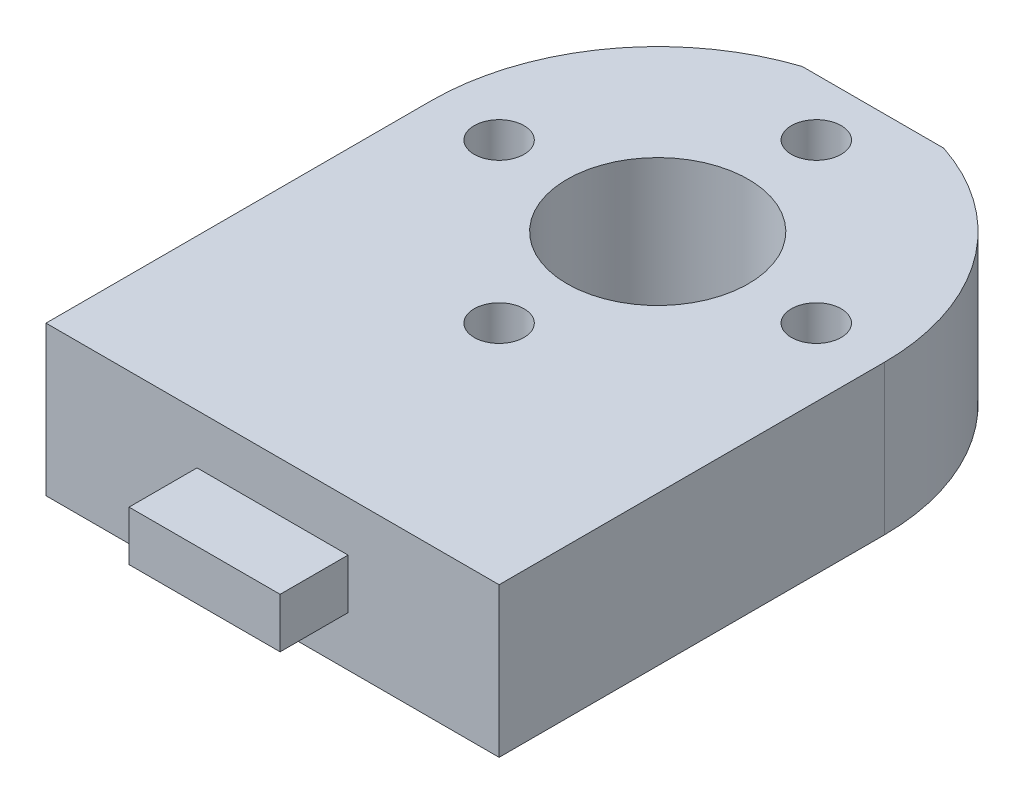
ISO-10303-21;
HEADER;
FILE_DESCRIPTION(('STEP AP214'),'2;1');
FILE_NAME('part.step','',(''),(''),'','','');
FILE_SCHEMA(('AUTOMOTIVE_DESIGN { 1 0 10303 214 1 1 1 1 }'));
ENDSEC;
DATA;
#1=APPLICATION_CONTEXT('core data for automotive mechanical design processes');
#2=APPLICATION_PROTOCOL_DEFINITION('international standard','automotive_design',2000,#1);
#3=PRODUCT_CONTEXT('',#1,'mechanical');
#4=PRODUCT('Part','Part','',(#3));
#5=PRODUCT_RELATED_PRODUCT_CATEGORY('part','',(#4));
#6=PRODUCT_DEFINITION_FORMATION('','',#4);
#7=PRODUCT_DEFINITION_CONTEXT('part definition',#1,'design');
#8=PRODUCT_DEFINITION('design','',#6,#7);
#9=PRODUCT_DEFINITION_SHAPE('','',#8);
#10=(LENGTH_UNIT() NAMED_UNIT(*) SI_UNIT(.MILLI.,.METRE.));
#11=(NAMED_UNIT(*) PLANE_ANGLE_UNIT() SI_UNIT($,.RADIAN.));
#12=(NAMED_UNIT(*) SI_UNIT($,.STERADIAN.) SOLID_ANGLE_UNIT());
#13=UNCERTAINTY_MEASURE_WITH_UNIT(LENGTH_MEASURE(1.E-05),#10,'distance_accuracy_value','');
#14=(GEOMETRIC_REPRESENTATION_CONTEXT(3) GLOBAL_UNCERTAINTY_ASSIGNED_CONTEXT((#13)) GLOBAL_UNIT_ASSIGNED_CONTEXT((#10,
#11,#12)) REPRESENTATION_CONTEXT('',''));
#15=CARTESIAN_POINT('',(0.,0.,0.));
#16=DIRECTION('',(0.,0.,1.));
#17=DIRECTION('',(1.,0.,0.));
#18=AXIS2_PLACEMENT_3D('',#15,#16,#17);
#19=CARTESIAN_POINT('',(-10.,6.6,17.));
#20=DIRECTION('',(0.,0.,-1.));
#21=DIRECTION('',(-1.,0.,0.));
#22=AXIS2_PLACEMENT_3D('',#19,#20,#21);
#23=PLANE('',#22);
#24=DIRECTION('',(1.,0.,0.));
#25=VECTOR('',#24,1.);
#26=CARTESIAN_POINT('',(-10.,0.,17.));
#27=LINE('',#26,#25);
#28=CARTESIAN_POINT('',(-10.,0.,17.));
#29=VERTEX_POINT('',#28);
#30=CARTESIAN_POINT('',(10.,0.,17.));
#31=VERTEX_POINT('',#30);
#32=EDGE_CURVE('E191',#29,#31,#27,.T.);
#33=ORIENTED_EDGE('',*,*,#32,.T.);
#34=DIRECTION('',(0.,-1.,0.));
#35=VECTOR('',#34,1.);
#36=CARTESIAN_POINT('',(10.,6.6,17.));
#37=LINE('',#36,#35);
#38=CARTESIAN_POINT('',(10.,6.6,17.));
#39=VERTEX_POINT('',#38);
#40=EDGE_CURVE('E48',#39,#31,#37,.T.);
#41=ORIENTED_EDGE('',*,*,#40,.F.);
#42=DIRECTION('',(1.,0.,0.));
#43=VECTOR('',#42,1.);
#44=CARTESIAN_POINT('',(-10.,6.6,17.));
#45=LINE('',#44,#43);
#46=CARTESIAN_POINT('',(-10.,6.6,17.));
#47=VERTEX_POINT('',#46);
#48=EDGE_CURVE('E177',#47,#39,#45,.T.);
#49=ORIENTED_EDGE('',*,*,#48,.F.);
#50=DIRECTION('',(0.,-1.,0.));
#51=VECTOR('',#50,1.);
#52=CARTESIAN_POINT('',(-10.,6.6,17.));
#53=LINE('',#52,#51);
#54=EDGE_CURVE('E11',#47,#29,#53,.T.);
#55=ORIENTED_EDGE('',*,*,#54,.T.);
#56=EDGE_LOOP('',(#33,#41,#49,#55));
#57=FACE_BOUND('',#56,.T.);
#58=DIRECTION('',(0.,1.,0.));
#59=VECTOR('',#58,1.);
#60=CARTESIAN_POINT('',(3.33333333333334,0.,17.));
#61=LINE('',#60,#59);
#62=CARTESIAN_POINT('',(3.33333333333334,2.2,17.));
#63=VERTEX_POINT('',#62);
#64=CARTESIAN_POINT('',(3.33333333333333,4.4,17.));
#65=VERTEX_POINT('',#64);
#66=EDGE_CURVE('E55',#63,#65,#61,.T.);
#67=ORIENTED_EDGE('',*,*,#66,.F.);
#68=DIRECTION('',(-1.,0.,0.));
#69=VECTOR('',#68,1.);
#70=CARTESIAN_POINT('',(0.,2.2,17.));
#71=LINE('',#70,#69);
#72=CARTESIAN_POINT('',(-3.33333333333334,2.2,17.));
#73=VERTEX_POINT('',#72);
#74=EDGE_CURVE('E60',#63,#73,#71,.T.);
#75=ORIENTED_EDGE('',*,*,#74,.T.);
#76=DIRECTION('',(0.,1.,0.));
#77=VECTOR('',#76,1.);
#78=CARTESIAN_POINT('',(-3.33333333333334,0.,17.));
#79=LINE('',#78,#77);
#80=CARTESIAN_POINT('',(-3.33333333333334,4.4,17.));
#81=VERTEX_POINT('',#80);
#82=EDGE_CURVE('E402',#73,#81,#79,.T.);
#83=ORIENTED_EDGE('',*,*,#82,.T.);
#84=DIRECTION('',(-1.,0.,0.));
#85=VECTOR('',#84,1.);
#86=CARTESIAN_POINT('',(0.,4.4,17.));
#87=LINE('',#86,#85);
#88=EDGE_CURVE('E404',#65,#81,#87,.T.);
#89=ORIENTED_EDGE('',*,*,#88,.F.);
#90=EDGE_LOOP('',(#67,#75,#83,#89));
#91=FACE_BOUND('',#90,.T.);
#92=ADVANCED_FACE('F40',(#57,#91),#23,.F.);
#93=CARTESIAN_POINT('',(0.,6.6,0.));
#94=DIRECTION('',(0.,1.,0.));
#95=DIRECTION('',(0.,0.,1.));
#96=AXIS2_PLACEMENT_3D('',#93,#94,#95);
#97=PLANE('',#96);
#98=CARTESIAN_POINT('',(7.,6.6,0.));
#99=DIRECTION('',(0.,1.,0.));
#100=DIRECTION('',(0.,0.,1.));
#101=AXIS2_PLACEMENT_3D('',#98,#99,#100);
#102=CIRCLE('',#101,1.1);
#103=CARTESIAN_POINT('',(7.,6.6,1.10000000000005));
#104=VERTEX_POINT('',#103);
#105=EDGE_CURVE('E150',#104,#104,#102,.T.);
#106=ORIENTED_EDGE('',*,*,#105,.F.);
#107=EDGE_LOOP('',(#106));
#108=FACE_BOUND('',#107,.T.);
#109=CARTESIAN_POINT('',(0.,6.6,0.));
#110=DIRECTION('',(0.,1.,0.));
#111=DIRECTION('',(0.,0.,1.));
#112=AXIS2_PLACEMENT_3D('',#109,#110,#111);
#113=CIRCLE('',#112,4.);
#114=CARTESIAN_POINT('',(0.,6.6,4.));
#115=VERTEX_POINT('',#114);
#116=EDGE_CURVE('E162',#115,#115,#113,.T.);
#117=ORIENTED_EDGE('',*,*,#116,.F.);
#118=EDGE_LOOP('',(#117));
#119=FACE_BOUND('',#118,.T.);
#120=DIRECTION('',(0.,0.,1.));
#121=VECTOR('',#120,1.);
#122=CARTESIAN_POINT('',(-10.,6.6,17.));
#123=LINE('',#122,#121);
#124=CARTESIAN_POINT('',(-10.,6.6,0.));
#125=VERTEX_POINT('',#124);
#126=EDGE_CURVE('E174',#125,#47,#123,.T.);
#127=ORIENTED_EDGE('',*,*,#126,.T.);
#128=ORIENTED_EDGE('',*,*,#48,.T.);
#129=DIRECTION('',(0.,0.,-1.));
#130=VECTOR('',#129,1.);
#131=CARTESIAN_POINT('',(10.,6.6,17.));
#132=LINE('',#131,#130);
#133=CARTESIAN_POINT('',(10.,6.6,0.));
#134=VERTEX_POINT('',#133);
#135=EDGE_CURVE('E180',#39,#134,#132,.T.);
#136=ORIENTED_EDGE('',*,*,#135,.T.);
#137=CARTESIAN_POINT('',(0.,6.6,0.));
#138=DIRECTION('',(0.,1.,0.));
#139=DIRECTION('',(0.,0.,1.));
#140=AXIS2_PLACEMENT_3D('',#137,#138,#139);
#141=CIRCLE('',#140,10.);
#142=CARTESIAN_POINT('',(3.1224989991992,6.6,-9.5));
#143=VERTEX_POINT('',#142);
#144=EDGE_CURVE('E182',#134,#143,#141,.T.);
#145=ORIENTED_EDGE('',*,*,#144,.T.);
#146=DIRECTION('',(-1.,0.,0.));
#147=VECTOR('',#146,1.);
#148=CARTESIAN_POINT('',(-3.12249899919921,6.6,-9.5));
#149=LINE('',#148,#147);
#150=CARTESIAN_POINT('',(-3.12249899919921,6.6,-9.5));
#151=VERTEX_POINT('',#150);
#152=EDGE_CURVE('E184',#143,#151,#149,.T.);
#153=ORIENTED_EDGE('',*,*,#152,.T.);
#154=CARTESIAN_POINT('',(0.,6.6,0.));
#155=DIRECTION('',(0.,1.,0.));
#156=DIRECTION('',(0.,0.,1.));
#157=AXIS2_PLACEMENT_3D('',#154,#155,#156);
#158=CIRCLE('',#157,10.);
#159=EDGE_CURVE('E186',#151,#125,#158,.T.);
#160=ORIENTED_EDGE('',*,*,#159,.T.);
#161=EDGE_LOOP('',(#127,#128,#136,#145,#153,#160));
#162=FACE_BOUND('',#161,.T.);
#163=CARTESIAN_POINT('',(-7.,6.6,0.));
#164=DIRECTION('',(0.,1.,0.));
#165=DIRECTION('',(0.,0.,1.));
#166=AXIS2_PLACEMENT_3D('',#163,#164,#165);
#167=CIRCLE('',#166,1.1);
#168=CARTESIAN_POINT('',(-7.,6.6,1.1));
#169=VERTEX_POINT('',#168);
#170=EDGE_CURVE('E168',#169,#169,#167,.T.);
#171=ORIENTED_EDGE('',*,*,#170,.F.);
#172=EDGE_LOOP('',(#171));
#173=FACE_BOUND('',#172,.T.);
#174=CARTESIAN_POINT('',(0.,6.6,-7.));
#175=DIRECTION('',(0.,1.,0.));
#176=DIRECTION('',(0.,0.,1.));
#177=AXIS2_PLACEMENT_3D('',#174,#175,#176);
#178=CIRCLE('',#177,1.1);
#179=CARTESIAN_POINT('',(0.,6.6,-5.9));
#180=VERTEX_POINT('',#179);
#181=EDGE_CURVE('E156',#180,#180,#178,.T.);
#182=ORIENTED_EDGE('',*,*,#181,.F.);
#183=EDGE_LOOP('',(#182));
#184=FACE_BOUND('',#183,.T.);
#185=CARTESIAN_POINT('',(0.,6.6,7.));
#186=DIRECTION('',(0.,1.,0.));
#187=DIRECTION('',(0.,0.,1.));
#188=AXIS2_PLACEMENT_3D('',#185,#186,#187);
#189=CIRCLE('',#188,1.1);
#190=CARTESIAN_POINT('',(0.,6.6,8.1));
#191=VERTEX_POINT('',#190);
#192=EDGE_CURVE('E141',#191,#191,#189,.T.);
#193=ORIENTED_EDGE('',*,*,#192,.F.);
#194=EDGE_LOOP('',(#193));
#195=FACE_BOUND('',#194,.T.);
#196=ADVANCED_FACE('F235',(#108,#119,#162,#173,#184,#195),#97,.T.);
#197=CARTESIAN_POINT('',(0.,0.,0.));
#198=DIRECTION('',(0.,1.,0.));
#199=DIRECTION('',(0.,0.,1.));
#200=AXIS2_PLACEMENT_3D('',#197,#198,#199);
#201=PLANE('',#200);
#202=DIRECTION('',(0.,0.,1.));
#203=VECTOR('',#202,1.);
#204=CARTESIAN_POINT('',(-10.,0.,17.));
#205=LINE('',#204,#203);
#206=CARTESIAN_POINT('',(-10.,0.,0.));
#207=VERTEX_POINT('',#206);
#208=EDGE_CURVE('E171',#207,#29,#205,.T.);
#209=ORIENTED_EDGE('',*,*,#208,.F.);
#210=CARTESIAN_POINT('',(0.,0.,0.));
#211=DIRECTION('',(0.,1.,0.));
#212=DIRECTION('',(0.,0.,1.));
#213=AXIS2_PLACEMENT_3D('',#210,#211,#212);
#214=CIRCLE('',#213,10.);
#215=CARTESIAN_POINT('',(-3.12249899919921,0.,-9.5));
#216=VERTEX_POINT('',#215);
#217=EDGE_CURVE('E178',#216,#207,#214,.T.);
#218=ORIENTED_EDGE('',*,*,#217,.F.);
#219=DIRECTION('',(-1.,0.,0.));
#220=VECTOR('',#219,1.);
#221=CARTESIAN_POINT('',(-3.12249899919921,0.,-9.5));
#222=LINE('',#221,#220);
#223=CARTESIAN_POINT('',(3.1224989991992,0.,-9.5));
#224=VERTEX_POINT('',#223);
#225=EDGE_CURVE('E197',#224,#216,#222,.T.);
#226=ORIENTED_EDGE('',*,*,#225,.F.);
#227=CARTESIAN_POINT('',(0.,0.,0.));
#228=DIRECTION('',(0.,1.,0.));
#229=DIRECTION('',(0.,0.,1.));
#230=AXIS2_PLACEMENT_3D('',#227,#228,#229);
#231=CIRCLE('',#230,10.);
#232=CARTESIAN_POINT('',(10.,0.,0.));
#233=VERTEX_POINT('',#232);
#234=EDGE_CURVE('E195',#233,#224,#231,.T.);
#235=ORIENTED_EDGE('',*,*,#234,.F.);
#236=DIRECTION('',(0.,0.,-1.));
#237=VECTOR('',#236,1.);
#238=CARTESIAN_POINT('',(10.,0.,17.));
#239=LINE('',#238,#237);
#240=EDGE_CURVE('E193',#31,#233,#239,.T.);
#241=ORIENTED_EDGE('',*,*,#240,.F.);
#242=ORIENTED_EDGE('',*,*,#32,.F.);
#243=EDGE_LOOP('',(#209,#218,#226,#235,#241,#242));
#244=FACE_BOUND('',#243,.T.);
#245=CARTESIAN_POINT('',(-7.,0.,0.));
#246=DIRECTION('',(0.,1.,0.));
#247=DIRECTION('',(0.,0.,1.));
#248=AXIS2_PLACEMENT_3D('',#245,#246,#247);
#249=CIRCLE('',#248,1.1);
#250=CARTESIAN_POINT('',(-7.,0.,1.1));
#251=VERTEX_POINT('',#250);
#252=EDGE_CURVE('E165',#251,#251,#249,.T.);
#253=ORIENTED_EDGE('',*,*,#252,.T.);
#254=EDGE_LOOP('',(#253));
#255=FACE_BOUND('',#254,.T.);
#256=CARTESIAN_POINT('',(0.,0.,0.));
#257=DIRECTION('',(0.,1.,0.));
#258=DIRECTION('',(0.,0.,1.));
#259=AXIS2_PLACEMENT_3D('',#256,#257,#258);
#260=CIRCLE('',#259,4.);
#261=CARTESIAN_POINT('',(0.,0.,4.));
#262=VERTEX_POINT('',#261);
#263=EDGE_CURVE('E159',#262,#262,#260,.T.);
#264=ORIENTED_EDGE('',*,*,#263,.T.);
#265=EDGE_LOOP('',(#264));
#266=FACE_BOUND('',#265,.T.);
#267=CARTESIAN_POINT('',(0.,0.,-7.));
#268=DIRECTION('',(0.,1.,0.));
#269=DIRECTION('',(0.,0.,1.));
#270=AXIS2_PLACEMENT_3D('',#267,#268,#269);
#271=CIRCLE('',#270,1.1);
#272=CARTESIAN_POINT('',(0.,0.,-5.9));
#273=VERTEX_POINT('',#272);
#274=EDGE_CURVE('E153',#273,#273,#271,.T.);
#275=ORIENTED_EDGE('',*,*,#274,.T.);
#276=EDGE_LOOP('',(#275));
#277=FACE_BOUND('',#276,.T.);
#278=CARTESIAN_POINT('',(7.,0.,0.));
#279=DIRECTION('',(0.,1.,0.));
#280=DIRECTION('',(0.,0.,1.));
#281=AXIS2_PLACEMENT_3D('',#278,#279,#280);
#282=CIRCLE('',#281,1.1);
#283=CARTESIAN_POINT('',(7.,0.,1.10000000000005));
#284=VERTEX_POINT('',#283);
#285=EDGE_CURVE('E148',#284,#284,#282,.T.);
#286=ORIENTED_EDGE('',*,*,#285,.T.);
#287=EDGE_LOOP('',(#286));
#288=FACE_BOUND('',#287,.T.);
#289=CARTESIAN_POINT('',(0.,0.,7.));
#290=DIRECTION('',(0.,1.,0.));
#291=DIRECTION('',(0.,0.,1.));
#292=AXIS2_PLACEMENT_3D('',#289,#290,#291);
#293=CIRCLE('',#292,1.1);
#294=CARTESIAN_POINT('',(0.,0.,8.1));
#295=VERTEX_POINT('',#294);
#296=EDGE_CURVE('E138',#295,#295,#293,.T.);
#297=ORIENTED_EDGE('',*,*,#296,.T.);
#298=EDGE_LOOP('',(#297));
#299=FACE_BOUND('',#298,.T.);
#300=ADVANCED_FACE('F221',(#244,#255,#266,#277,#288,#299),#201,.F.);
#301=CARTESIAN_POINT('',(-10.,6.6,17.));
#302=DIRECTION('',(1.,0.,0.));
#303=DIRECTION('',(0.,0.,-1.));
#304=AXIS2_PLACEMENT_3D('',#301,#302,#303);
#305=PLANE('',#304);
#306=ORIENTED_EDGE('',*,*,#208,.T.);
#307=ORIENTED_EDGE('',*,*,#54,.F.);
#308=ORIENTED_EDGE('',*,*,#126,.F.);
#309=DIRECTION('',(0.,-1.,0.));
#310=VECTOR('',#309,1.);
#311=CARTESIAN_POINT('',(-10.,6.6,0.));
#312=LINE('',#311,#310);
#313=EDGE_CURVE('E188',#125,#207,#312,.T.);
#314=ORIENTED_EDGE('',*,*,#313,.T.);
#315=EDGE_LOOP('',(#306,#307,#308,#314));
#316=FACE_BOUND('',#315,.T.);
#317=ADVANCED_FACE('F42',(#316),#305,.F.);
#318=CARTESIAN_POINT('',(10.,6.6,17.));
#319=DIRECTION('',(-1.,0.,0.));
#320=DIRECTION('',(0.,0.,1.));
#321=AXIS2_PLACEMENT_3D('',#318,#319,#320);
#322=PLANE('',#321);
#323=ORIENTED_EDGE('',*,*,#240,.T.);
#324=DIRECTION('',(0.,-1.,0.));
#325=VECTOR('',#324,1.);
#326=CARTESIAN_POINT('',(10.,6.6,0.));
#327=LINE('',#326,#325);
#328=EDGE_CURVE('E208',#134,#233,#327,.T.);
#329=ORIENTED_EDGE('',*,*,#328,.F.);
#330=ORIENTED_EDGE('',*,*,#135,.F.);
#331=ORIENTED_EDGE('',*,*,#40,.T.);
#332=EDGE_LOOP('',(#323,#329,#330,#331));
#333=FACE_BOUND('',#332,.T.);
#334=ADVANCED_FACE('F215',(#333),#322,.F.);
#335=CARTESIAN_POINT('',(0.,6.6,0.));
#336=DIRECTION('',(0.,-1.,0.));
#337=DIRECTION('',(0.,0.,-1.));
#338=AXIS2_PLACEMENT_3D('',#335,#336,#337);
#339=CYLINDRICAL_SURFACE('',#338,10.);
#340=ORIENTED_EDGE('',*,*,#234,.T.);
#341=DIRECTION('',(0.,-1.,0.));
#342=VECTOR('',#341,1.);
#343=CARTESIAN_POINT('',(3.1224989991992,6.6,-9.5));
#344=LINE('',#343,#342);
#345=EDGE_CURVE('E205',#143,#224,#344,.T.);
#346=ORIENTED_EDGE('',*,*,#345,.F.);
#347=ORIENTED_EDGE('',*,*,#144,.F.);
#348=ORIENTED_EDGE('',*,*,#328,.T.);
#349=EDGE_LOOP('',(#340,#346,#347,#348));
#350=FACE_BOUND('',#349,.T.);
#351=ADVANCED_FACE('F227',(#350),#339,.T.);
#352=CARTESIAN_POINT('',(-3.12249899919921,6.6,-9.5));
#353=DIRECTION('',(0.,0.,1.));
#354=DIRECTION('',(1.,0.,0.));
#355=AXIS2_PLACEMENT_3D('',#352,#353,#354);
#356=PLANE('',#355);
#357=ORIENTED_EDGE('',*,*,#225,.T.);
#358=DIRECTION('',(0.,-1.,0.));
#359=VECTOR('',#358,1.);
#360=CARTESIAN_POINT('',(-3.12249899919921,6.6,-9.5));
#361=LINE('',#360,#359);
#362=EDGE_CURVE('E202',#151,#216,#361,.T.);
#363=ORIENTED_EDGE('',*,*,#362,.F.);
#364=ORIENTED_EDGE('',*,*,#152,.F.);
#365=ORIENTED_EDGE('',*,*,#345,.T.);
#366=EDGE_LOOP('',(#357,#363,#364,#365));
#367=FACE_BOUND('',#366,.T.);
#368=ADVANCED_FACE('F231',(#367),#356,.F.);
#369=CARTESIAN_POINT('',(0.,6.6,0.));
#370=DIRECTION('',(0.,-1.,0.));
#371=DIRECTION('',(0.,0.,-1.));
#372=AXIS2_PLACEMENT_3D('',#369,#370,#371);
#373=CYLINDRICAL_SURFACE('',#372,10.);
#374=ORIENTED_EDGE('',*,*,#217,.T.);
#375=ORIENTED_EDGE('',*,*,#313,.F.);
#376=ORIENTED_EDGE('',*,*,#159,.F.);
#377=ORIENTED_EDGE('',*,*,#362,.T.);
#378=EDGE_LOOP('',(#374,#375,#376,#377));
#379=FACE_BOUND('',#378,.T.);
#380=ADVANCED_FACE('F242',(#379),#373,.T.);
#381=CARTESIAN_POINT('',(-7.,6.6,0.));
#382=DIRECTION('',(0.,-1.,0.));
#383=DIRECTION('',(0.,0.,-1.));
#384=AXIS2_PLACEMENT_3D('',#381,#382,#383);
#385=CYLINDRICAL_SURFACE('',#384,1.1);
#386=ORIENTED_EDGE('',*,*,#170,.T.);
#387=EDGE_LOOP('',(#386));
#388=FACE_BOUND('',#387,.T.);
#389=ORIENTED_EDGE('',*,*,#252,.F.);
#390=EDGE_LOOP('',(#389));
#391=FACE_BOUND('',#390,.T.);
#392=ADVANCED_FACE('F244',(#388,#391),#385,.F.);
#393=CARTESIAN_POINT('',(0.,6.6,0.));
#394=DIRECTION('',(0.,-1.,0.));
#395=DIRECTION('',(0.,0.,-1.));
#396=AXIS2_PLACEMENT_3D('',#393,#394,#395);
#397=CYLINDRICAL_SURFACE('',#396,4.);
#398=ORIENTED_EDGE('',*,*,#116,.T.);
#399=EDGE_LOOP('',(#398));
#400=FACE_BOUND('',#399,.T.);
#401=ORIENTED_EDGE('',*,*,#263,.F.);
#402=EDGE_LOOP('',(#401));
#403=FACE_BOUND('',#402,.T.);
#404=ADVANCED_FACE('F250',(#400,#403),#397,.F.);
#405=CARTESIAN_POINT('',(0.,6.6,-7.));
#406=DIRECTION('',(0.,-1.,0.));
#407=DIRECTION('',(0.,0.,-1.));
#408=AXIS2_PLACEMENT_3D('',#405,#406,#407);
#409=CYLINDRICAL_SURFACE('',#408,1.1);
#410=ORIENTED_EDGE('',*,*,#181,.T.);
#411=EDGE_LOOP('',(#410));
#412=FACE_BOUND('',#411,.T.);
#413=ORIENTED_EDGE('',*,*,#274,.F.);
#414=EDGE_LOOP('',(#413));
#415=FACE_BOUND('',#414,.T.);
#416=ADVANCED_FACE('F293',(#412,#415),#409,.F.);
#417=CARTESIAN_POINT('',(7.,6.6,0.));
#418=DIRECTION('',(0.,-1.,0.));
#419=DIRECTION('',(0.,0.,-1.));
#420=AXIS2_PLACEMENT_3D('',#417,#418,#419);
#421=CYLINDRICAL_SURFACE('',#420,1.1);
#422=ORIENTED_EDGE('',*,*,#105,.T.);
#423=EDGE_LOOP('',(#422));
#424=FACE_BOUND('',#423,.T.);
#425=ORIENTED_EDGE('',*,*,#285,.F.);
#426=EDGE_LOOP('',(#425));
#427=FACE_BOUND('',#426,.T.);
#428=ADVANCED_FACE('F303',(#424,#427),#421,.F.);
#429=CARTESIAN_POINT('',(0.,6.6,7.));
#430=DIRECTION('',(0.,-1.,0.));
#431=DIRECTION('',(0.,0.,-1.));
#432=AXIS2_PLACEMENT_3D('',#429,#430,#431);
#433=CYLINDRICAL_SURFACE('',#432,1.1);
#434=ORIENTED_EDGE('',*,*,#192,.T.);
#435=EDGE_LOOP('',(#434));
#436=FACE_BOUND('',#435,.T.);
#437=ORIENTED_EDGE('',*,*,#296,.F.);
#438=EDGE_LOOP('',(#437));
#439=FACE_BOUND('',#438,.T.);
#440=ADVANCED_FACE('F313',(#436,#439),#433,.F.);
#441=CARTESIAN_POINT('',(3.33333333333334,0.,20.));
#442=DIRECTION('',(-1.,0.,0.));
#443=DIRECTION('',(0.,-1.,0.));
#444=AXIS2_PLACEMENT_3D('',#441,#442,#443);
#445=PLANE('',#444);
#446=ORIENTED_EDGE('',*,*,#66,.T.);
#447=DIRECTION('',(0.,0.,-1.));
#448=VECTOR('',#447,1.);
#449=CARTESIAN_POINT('',(3.33333333333333,4.4,20.));
#450=LINE('',#449,#448);
#451=CARTESIAN_POINT('',(3.33333333333333,4.4,20.));
#452=VERTEX_POINT('',#451);
#453=EDGE_CURVE('E121',#452,#65,#450,.T.);
#454=ORIENTED_EDGE('',*,*,#453,.F.);
#455=DIRECTION('',(0.,1.,0.));
#456=VECTOR('',#455,1.);
#457=CARTESIAN_POINT('',(3.33333333333334,0.,20.));
#458=LINE('',#457,#456);
#459=CARTESIAN_POINT('',(3.33333333333334,2.2,20.));
#460=VERTEX_POINT('',#459);
#461=EDGE_CURVE('E128',#460,#452,#458,.T.);
#462=ORIENTED_EDGE('',*,*,#461,.F.);
#463=DIRECTION('',(0.,0.,-1.));
#464=VECTOR('',#463,1.);
#465=CARTESIAN_POINT('',(3.33333333333334,2.2,20.));
#466=LINE('',#465,#464);
#467=EDGE_CURVE('E400',#460,#63,#466,.T.);
#468=ORIENTED_EDGE('',*,*,#467,.T.);
#469=EDGE_LOOP('',(#446,#454,#462,#468));
#470=FACE_BOUND('',#469,.T.);
#471=ADVANCED_FACE('F137',(#470),#445,.F.);
#472=CARTESIAN_POINT('',(0.,4.4,20.));
#473=DIRECTION('',(0.,-1.,0.));
#474=DIRECTION('',(1.,0.,0.));
#475=AXIS2_PLACEMENT_3D('',#472,#473,#474);
#476=PLANE('',#475);
#477=ORIENTED_EDGE('',*,*,#88,.T.);
#478=DIRECTION('',(0.,0.,-1.));
#479=VECTOR('',#478,1.);
#480=CARTESIAN_POINT('',(-3.33333333333334,4.4,20.));
#481=LINE('',#480,#479);
#482=CARTESIAN_POINT('',(-3.33333333333334,4.4,20.));
#483=VERTEX_POINT('',#482);
#484=EDGE_CURVE('E123',#483,#81,#481,.T.);
#485=ORIENTED_EDGE('',*,*,#484,.F.);
#486=DIRECTION('',(-1.,0.,0.));
#487=VECTOR('',#486,1.);
#488=CARTESIAN_POINT('',(0.,4.4,20.));
#489=LINE('',#488,#487);
#490=EDGE_CURVE('E116',#452,#483,#489,.T.);
#491=ORIENTED_EDGE('',*,*,#490,.F.);
#492=ORIENTED_EDGE('',*,*,#453,.T.);
#493=EDGE_LOOP('',(#477,#485,#491,#492));
#494=FACE_BOUND('',#493,.T.);
#495=ADVANCED_FACE('F119',(#494),#476,.F.);
#496=CARTESIAN_POINT('',(-3.33333333333334,0.,20.));
#497=DIRECTION('',(-1.,0.,0.));
#498=DIRECTION('',(0.,0.,1.));
#499=AXIS2_PLACEMENT_3D('',#496,#497,#498);
#500=PLANE('',#499);
#501=ORIENTED_EDGE('',*,*,#82,.F.);
#502=DIRECTION('',(0.,0.,-1.));
#503=VECTOR('',#502,1.);
#504=CARTESIAN_POINT('',(-3.33333333333334,2.2,20.));
#505=LINE('',#504,#503);
#506=CARTESIAN_POINT('',(-3.33333333333334,2.2,20.));
#507=VERTEX_POINT('',#506);
#508=EDGE_CURVE('E143',#507,#73,#505,.T.);
#509=ORIENTED_EDGE('',*,*,#508,.F.);
#510=DIRECTION('',(0.,1.,0.));
#511=VECTOR('',#510,1.);
#512=CARTESIAN_POINT('',(-3.33333333333334,0.,20.));
#513=LINE('',#512,#511);
#514=EDGE_CURVE('E127',#507,#483,#513,.T.);
#515=ORIENTED_EDGE('',*,*,#514,.T.);
#516=ORIENTED_EDGE('',*,*,#484,.T.);
#517=EDGE_LOOP('',(#501,#509,#515,#516));
#518=FACE_BOUND('',#517,.T.);
#519=ADVANCED_FACE('F344',(#518),#500,.T.);
#520=CARTESIAN_POINT('',(0.,2.2,20.));
#521=DIRECTION('',(0.,-1.,0.));
#522=DIRECTION('',(0.,0.,-1.));
#523=AXIS2_PLACEMENT_3D('',#520,#521,#522);
#524=PLANE('',#523);
#525=ORIENTED_EDGE('',*,*,#74,.F.);
#526=ORIENTED_EDGE('',*,*,#467,.F.);
#527=DIRECTION('',(-1.,0.,0.));
#528=VECTOR('',#527,1.);
#529=CARTESIAN_POINT('',(0.,2.2,20.));
#530=LINE('',#529,#528);
#531=EDGE_CURVE('E134',#460,#507,#530,.T.);
#532=ORIENTED_EDGE('',*,*,#531,.T.);
#533=ORIENTED_EDGE('',*,*,#508,.T.);
#534=EDGE_LOOP('',(#525,#526,#532,#533));
#535=FACE_BOUND('',#534,.T.);
#536=ADVANCED_FACE('F353',(#535),#524,.T.);
#537=CARTESIAN_POINT('',(0.,0.,20.));
#538=DIRECTION('',(0.,0.,1.));
#539=DIRECTION('',(1.,0.,0.));
#540=AXIS2_PLACEMENT_3D('',#537,#538,#539);
#541=PLANE('',#540);
#542=ORIENTED_EDGE('',*,*,#461,.T.);
#543=ORIENTED_EDGE('',*,*,#490,.T.);
#544=ORIENTED_EDGE('',*,*,#514,.F.);
#545=ORIENTED_EDGE('',*,*,#531,.F.);
#546=EDGE_LOOP('',(#542,#543,#544,#545));
#547=FACE_BOUND('',#546,.T.);
#548=ADVANCED_FACE('F132',(#547),#541,.T.);
#549=CLOSED_SHELL('',(#92,#196,#300,#317,#334,#351,#368,#380,#392,#404,#416,#428,#440,#471,#495,
#519,#536,#548));
#550=MANIFOLD_SOLID_BREP('B2',#549);
#551=ADVANCED_BREP_SHAPE_REPRESENTATION('',(#18,#550),#14);
#552=SHAPE_DEFINITION_REPRESENTATION(#9,#551);
ENDSEC;
END-ISO-10303-21;
